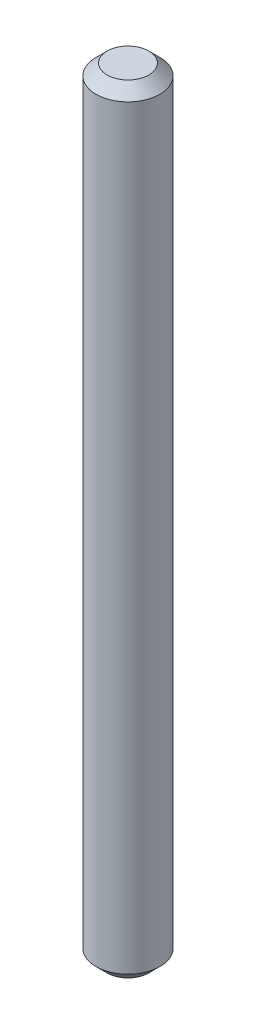
ISO-10303-21;
HEADER;
FILE_DESCRIPTION(('STEP AP214'),'2;1');
FILE_NAME('part.step','',(''),(''),'','','');
FILE_SCHEMA(('AUTOMOTIVE_DESIGN { 1 0 10303 214 1 1 1 1 }'));
ENDSEC;
DATA;
#1=APPLICATION_CONTEXT('core data for automotive mechanical design processes');
#2=APPLICATION_PROTOCOL_DEFINITION('international standard','automotive_design',2000,#1);
#3=PRODUCT_CONTEXT('',#1,'mechanical');
#4=PRODUCT('Part','Part','',(#3));
#5=PRODUCT_RELATED_PRODUCT_CATEGORY('part','',(#4));
#6=PRODUCT_DEFINITION_FORMATION('','',#4);
#7=PRODUCT_DEFINITION_CONTEXT('part definition',#1,'design');
#8=PRODUCT_DEFINITION('design','',#6,#7);
#9=PRODUCT_DEFINITION_SHAPE('','',#8);
#10=(LENGTH_UNIT() NAMED_UNIT(*) SI_UNIT(.MILLI.,.METRE.));
#11=(NAMED_UNIT(*) PLANE_ANGLE_UNIT() SI_UNIT($,.RADIAN.));
#12=(NAMED_UNIT(*) SI_UNIT($,.STERADIAN.) SOLID_ANGLE_UNIT());
#13=UNCERTAINTY_MEASURE_WITH_UNIT(LENGTH_MEASURE(1.E-05),#10,'distance_accuracy_value','');
#14=(GEOMETRIC_REPRESENTATION_CONTEXT(3) GLOBAL_UNCERTAINTY_ASSIGNED_CONTEXT((#13)) GLOBAL_UNIT_ASSIGNED_CONTEXT((#10,
#11,#12)) REPRESENTATION_CONTEXT('',''));
#15=CARTESIAN_POINT('',(0.,0.,0.));
#16=DIRECTION('',(0.,0.,1.));
#17=DIRECTION('',(1.,0.,0.));
#18=AXIS2_PLACEMENT_3D('',#15,#16,#17);
#19=CARTESIAN_POINT('',(0.,35.,0.));
#20=DIRECTION('',(0.,-1.,0.));
#21=DIRECTION('',(0.,0.,-1.));
#22=AXIS2_PLACEMENT_3D('',#19,#20,#21);
#23=CYLINDRICAL_SURFACE('',#22,2.875);
#24=CARTESIAN_POINT('',(0.,-34.,0.));
#25=DIRECTION('',(0.,1.,0.));
#26=DIRECTION('',(0.,0.,1.));
#27=AXIS2_PLACEMENT_3D('',#24,#25,#26);
#28=CIRCLE('',#27,2.875);
#29=CARTESIAN_POINT('',(0.,-34.,2.875));
#30=VERTEX_POINT('',#29);
#31=EDGE_CURVE('E55',#30,#30,#28,.T.);
#32=ORIENTED_EDGE('',*,*,#31,.T.);
#33=EDGE_LOOP('',(#32));
#34=FACE_BOUND('',#33,.T.);
#35=CARTESIAN_POINT('',(0.,34.,0.));
#36=DIRECTION('',(0.,1.,0.));
#37=DIRECTION('',(0.,0.,1.));
#38=AXIS2_PLACEMENT_3D('',#35,#36,#37);
#39=CIRCLE('',#38,2.875);
#40=CARTESIAN_POINT('',(0.,34.,2.875));
#41=VERTEX_POINT('',#40);
#42=EDGE_CURVE('E59',#41,#41,#39,.F.);
#43=ORIENTED_EDGE('',*,*,#42,.T.);
#44=EDGE_LOOP('',(#43));
#45=FACE_BOUND('',#44,.T.);
#46=ADVANCED_FACE('F43',(#34,#45),#23,.T.);
#47=CARTESIAN_POINT('',(0.,35.,0.));
#48=DIRECTION('',(0.,1.,0.));
#49=DIRECTION('',(0.,0.,1.));
#50=AXIS2_PLACEMENT_3D('',#47,#48,#49);
#51=PLANE('',#50);
#52=CARTESIAN_POINT('',(0.,35.,0.));
#53=DIRECTION('',(0.,1.,0.));
#54=DIRECTION('',(0.,0.,1.));
#55=AXIS2_PLACEMENT_3D('',#52,#53,#54);
#56=CIRCLE('',#55,1.87500000000002);
#57=CARTESIAN_POINT('',(0.,35.,1.87500000000002));
#58=VERTEX_POINT('',#57);
#59=EDGE_CURVE('E10',#58,#58,#56,.T.);
#60=ORIENTED_EDGE('',*,*,#59,.T.);
#61=EDGE_LOOP('',(#60));
#62=FACE_BOUND('',#61,.T.);
#63=ADVANCED_FACE('F75',(#62),#51,.T.);
#64=CARTESIAN_POINT('',(0.,-35.,0.));
#65=DIRECTION('',(0.,1.,0.));
#66=DIRECTION('',(0.,0.,1.));
#67=AXIS2_PLACEMENT_3D('',#64,#65,#66);
#68=PLANE('',#67);
#69=CARTESIAN_POINT('',(0.,-35.,0.));
#70=DIRECTION('',(0.,1.,0.));
#71=DIRECTION('',(0.,0.,1.));
#72=AXIS2_PLACEMENT_3D('',#69,#70,#71);
#73=CIRCLE('',#72,1.875);
#74=CARTESIAN_POINT('',(0.,-35.,1.875));
#75=VERTEX_POINT('',#74);
#76=EDGE_CURVE('E51',#75,#75,#73,.F.);
#77=ORIENTED_EDGE('',*,*,#76,.T.);
#78=EDGE_LOOP('',(#77));
#79=FACE_BOUND('',#78,.T.);
#80=ADVANCED_FACE('F72',(#79),#68,.F.);
#81=CARTESIAN_POINT('',(0.,-34.,0.));
#82=DIRECTION('',(0.,1.,0.));
#83=DIRECTION('',(0.,0.,1.));
#84=AXIS2_PLACEMENT_3D('',#81,#82,#83);
#85=CONICAL_SURFACE('',#84,2.875,0.785398163397447);
#86=ORIENTED_EDGE('',*,*,#76,.F.);
#87=EDGE_LOOP('',(#86));
#88=FACE_BOUND('',#87,.T.);
#89=ORIENTED_EDGE('',*,*,#31,.F.);
#90=EDGE_LOOP('',(#89));
#91=FACE_BOUND('',#90,.T.);
#92=ADVANCED_FACE('F68',(#88,#91),#85,.T.);
#93=CARTESIAN_POINT('',(0.,35.,0.));
#94=DIRECTION('',(0.,-1.,0.));
#95=DIRECTION('',(0.,0.,-1.));
#96=AXIS2_PLACEMENT_3D('',#93,#94,#95);
#97=CONICAL_SURFACE('',#96,1.87500000000002,0.785398163397447);
#98=ORIENTED_EDGE('',*,*,#42,.F.);
#99=EDGE_LOOP('',(#98));
#100=FACE_BOUND('',#99,.T.);
#101=ORIENTED_EDGE('',*,*,#59,.F.);
#102=EDGE_LOOP('',(#101));
#103=FACE_BOUND('',#102,.T.);
#104=ADVANCED_FACE('F46',(#100,#103),#97,.T.);
#105=CLOSED_SHELL('',(#46,#63,#80,#92,#104));
#106=MANIFOLD_SOLID_BREP('B2',#105);
#107=ADVANCED_BREP_SHAPE_REPRESENTATION('',(#18,#106),#14);
#108=SHAPE_DEFINITION_REPRESENTATION(#9,#107);
ENDSEC;
END-ISO-10303-21;
